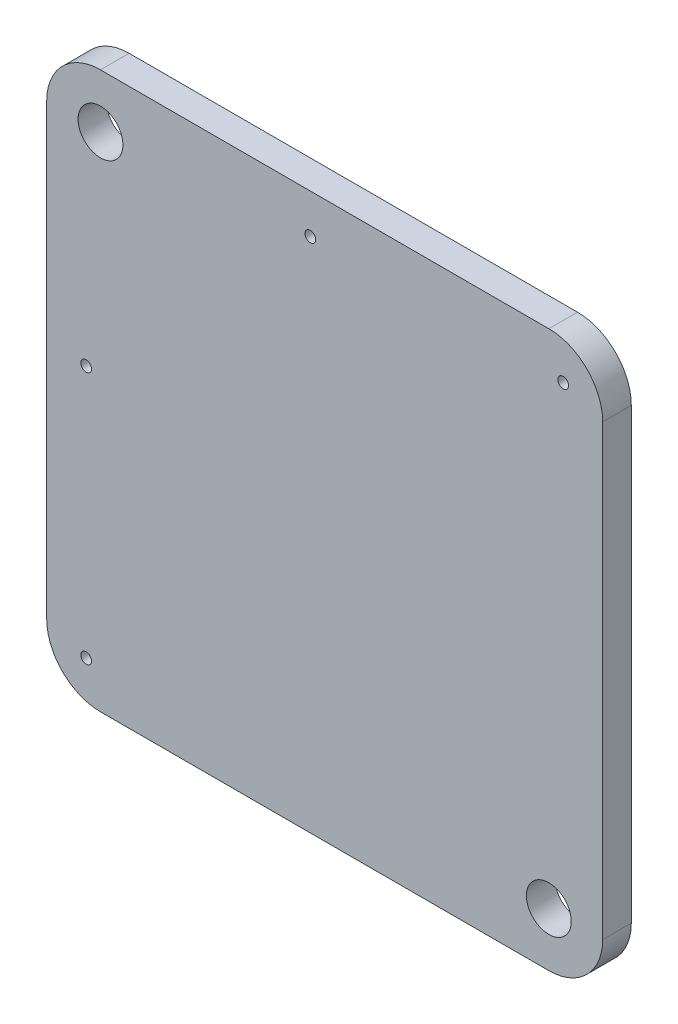
ISO-10303-21;
HEADER;
FILE_DESCRIPTION(('STEP AP214'),'2;1');
FILE_NAME('part.step','',(''),(''),'','','');
FILE_SCHEMA(('AUTOMOTIVE_DESIGN { 1 0 10303 214 1 1 1 1 }'));
ENDSEC;
DATA;
#1=APPLICATION_CONTEXT('core data for automotive mechanical design processes');
#2=APPLICATION_PROTOCOL_DEFINITION('international standard','automotive_design',2000,#1);
#3=PRODUCT_CONTEXT('',#1,'mechanical');
#4=PRODUCT('Part','Part','',(#3));
#5=PRODUCT_RELATED_PRODUCT_CATEGORY('part','',(#4));
#6=PRODUCT_DEFINITION_FORMATION('','',#4);
#7=PRODUCT_DEFINITION_CONTEXT('part definition',#1,'design');
#8=PRODUCT_DEFINITION('design','',#6,#7);
#9=PRODUCT_DEFINITION_SHAPE('','',#8);
#10=(LENGTH_UNIT() NAMED_UNIT(*) SI_UNIT(.MILLI.,.METRE.));
#11=(NAMED_UNIT(*) PLANE_ANGLE_UNIT() SI_UNIT($,.RADIAN.));
#12=(NAMED_UNIT(*) SI_UNIT($,.STERADIAN.) SOLID_ANGLE_UNIT());
#13=UNCERTAINTY_MEASURE_WITH_UNIT(LENGTH_MEASURE(1.E-05),#10,'distance_accuracy_value','');
#14=(GEOMETRIC_REPRESENTATION_CONTEXT(3) GLOBAL_UNCERTAINTY_ASSIGNED_CONTEXT((#13)) GLOBAL_UNIT_ASSIGNED_CONTEXT((#10,
#11,#12)) REPRESENTATION_CONTEXT('',''));
#15=CARTESIAN_POINT('',(0.,0.,0.));
#16=DIRECTION('',(0.,0.,1.));
#17=DIRECTION('',(1.,0.,0.));
#18=AXIS2_PLACEMENT_3D('',#15,#16,#17);
#19=CARTESIAN_POINT('',(111.941010000017,64.0809899999833,1.598));
#20=DIRECTION('',(0.,0.,-1.));
#21=DIRECTION('',(-1.,0.,0.));
#22=AXIS2_PLACEMENT_3D('',#19,#20,#21);
#23=CYLINDRICAL_SURFACE('',#22,2.99999);
#24=CARTESIAN_POINT('',(111.941010000017,64.0809899999833,0.));
#25=DIRECTION('',(0.,0.,1.));
#26=DIRECTION('',(-1.,0.,0.));
#27=AXIS2_PLACEMENT_3D('',#24,#25,#26);
#28=CIRCLE('',#27,2.99999);
#29=CARTESIAN_POINT('',(111.941,61.081,0.));
#30=VERTEX_POINT('',#29);
#31=CARTESIAN_POINT('',(114.941,64.081,0.));
#32=VERTEX_POINT('',#31);
#33=EDGE_CURVE('E138',#30,#32,#28,.T.);
#34=ORIENTED_EDGE('',*,*,#33,.T.);
#35=DIRECTION('',(0.,0.,-1.));
#36=VECTOR('',#35,1.);
#37=CARTESIAN_POINT('',(114.941,64.081,1.598));
#38=LINE('',#37,#36);
#39=CARTESIAN_POINT('',(114.941,64.081,1.598));
#40=VERTEX_POINT('',#39);
#41=EDGE_CURVE('E11',#40,#32,#38,.T.);
#42=ORIENTED_EDGE('',*,*,#41,.F.);
#43=CARTESIAN_POINT('',(111.941010000017,64.0809899999833,1.598));
#44=DIRECTION('',(0.,0.,1.));
#45=DIRECTION('',(-1.,0.,0.));
#46=AXIS2_PLACEMENT_3D('',#43,#44,#45);
#47=CIRCLE('',#46,2.99999);
#48=CARTESIAN_POINT('',(111.941,61.081,1.598));
#49=VERTEX_POINT('',#48);
#50=EDGE_CURVE('E153',#49,#40,#47,.T.);
#51=ORIENTED_EDGE('',*,*,#50,.F.);
#52=DIRECTION('',(0.,0.,-1.));
#53=VECTOR('',#52,1.);
#54=CARTESIAN_POINT('',(111.941,61.081,1.598));
#55=LINE('',#54,#53);
#56=EDGE_CURVE('E134',#49,#30,#55,.T.);
#57=ORIENTED_EDGE('',*,*,#56,.T.);
#58=EDGE_LOOP('',(#34,#42,#51,#57));
#59=FACE_BOUND('',#58,.T.);
#60=ADVANCED_FACE('F42',(#59),#23,.T.);
#61=CARTESIAN_POINT('',(114.941,89.081,1.598));
#62=DIRECTION('',(-1.,0.,0.));
#63=DIRECTION('',(0.,0.,1.));
#64=AXIS2_PLACEMENT_3D('',#61,#62,#63);
#65=PLANE('',#64);
#66=DIRECTION('',(0.,1.,0.));
#67=VECTOR('',#66,1.);
#68=CARTESIAN_POINT('',(114.941,89.081,0.));
#69=LINE('',#68,#67);
#70=CARTESIAN_POINT('',(114.941,89.081,0.));
#71=VERTEX_POINT('',#70);
#72=EDGE_CURVE('E141',#32,#71,#69,.T.);
#73=ORIENTED_EDGE('',*,*,#72,.T.);
#74=DIRECTION('',(0.,0.,-1.));
#75=VECTOR('',#74,1.);
#76=CARTESIAN_POINT('',(114.941,89.081,1.598));
#77=LINE('',#76,#75);
#78=CARTESIAN_POINT('',(114.941,89.081,1.598));
#79=VERTEX_POINT('',#78);
#80=EDGE_CURVE('E50',#79,#71,#77,.T.);
#81=ORIENTED_EDGE('',*,*,#80,.F.);
#82=DIRECTION('',(0.,1.,0.));
#83=VECTOR('',#82,1.);
#84=CARTESIAN_POINT('',(114.941,89.081,1.598));
#85=LINE('',#84,#83);
#86=EDGE_CURVE('E101',#40,#79,#85,.T.);
#87=ORIENTED_EDGE('',*,*,#86,.F.);
#88=ORIENTED_EDGE('',*,*,#41,.T.);
#89=EDGE_LOOP('',(#73,#81,#87,#88));
#90=FACE_BOUND('',#89,.T.);
#91=ADVANCED_FACE('F251',(#90),#65,.F.);
#92=CARTESIAN_POINT('',(111.941020000067,89.0810200000667,1.598));
#93=DIRECTION('',(0.,0.,-1.));
#94=DIRECTION('',(-1.,0.,0.));
#95=AXIS2_PLACEMENT_3D('',#92,#93,#94);
#96=CYLINDRICAL_SURFACE('',#95,2.99998);
#97=CARTESIAN_POINT('',(111.941020000067,89.0810200000667,0.));
#98=DIRECTION('',(0.,0.,1.));
#99=DIRECTION('',(-1.,0.,0.));
#100=AXIS2_PLACEMENT_3D('',#97,#98,#99);
#101=CIRCLE('',#100,2.99998);
#102=CARTESIAN_POINT('',(111.941,92.081,0.));
#103=VERTEX_POINT('',#102);
#104=EDGE_CURVE('E144',#71,#103,#101,.T.);
#105=ORIENTED_EDGE('',*,*,#104,.T.);
#106=DIRECTION('',(0.,0.,-1.));
#107=VECTOR('',#106,1.);
#108=CARTESIAN_POINT('',(111.941,92.081,1.598));
#109=LINE('',#108,#107);
#110=CARTESIAN_POINT('',(111.941,92.081,1.598));
#111=VERTEX_POINT('',#110);
#112=EDGE_CURVE('E160',#111,#103,#109,.T.);
#113=ORIENTED_EDGE('',*,*,#112,.F.);
#114=CARTESIAN_POINT('',(111.941020000067,89.0810200000667,1.598));
#115=DIRECTION('',(0.,0.,1.));
#116=DIRECTION('',(-1.,0.,0.));
#117=AXIS2_PLACEMENT_3D('',#114,#115,#116);
#118=CIRCLE('',#117,2.99998);
#119=EDGE_CURVE('E168',#79,#111,#118,.T.);
#120=ORIENTED_EDGE('',*,*,#119,.F.);
#121=ORIENTED_EDGE('',*,*,#80,.T.);
#122=EDGE_LOOP('',(#105,#113,#120,#121));
#123=FACE_BOUND('',#122,.T.);
#124=ADVANCED_FACE('F166',(#123),#96,.T.);
#125=CARTESIAN_POINT('',(86.941,92.081,1.598));
#126=DIRECTION('',(0.,-1.,0.));
#127=DIRECTION('',(0.,0.,-1.));
#128=AXIS2_PLACEMENT_3D('',#125,#126,#127);
#129=PLANE('',#128);
#130=DIRECTION('',(-1.,0.,0.));
#131=VECTOR('',#130,1.);
#132=CARTESIAN_POINT('',(86.941,92.081,0.));
#133=LINE('',#132,#131);
#134=CARTESIAN_POINT('',(86.941,92.081,0.));
#135=VERTEX_POINT('',#134);
#136=EDGE_CURVE('E146',#103,#135,#133,.T.);
#137=ORIENTED_EDGE('',*,*,#136,.T.);
#138=DIRECTION('',(0.,0.,-1.));
#139=VECTOR('',#138,1.);
#140=CARTESIAN_POINT('',(86.941,92.081,1.598));
#141=LINE('',#140,#139);
#142=CARTESIAN_POINT('',(86.941,92.081,1.598));
#143=VERTEX_POINT('',#142);
#144=EDGE_CURVE('E157',#143,#135,#141,.T.);
#145=ORIENTED_EDGE('',*,*,#144,.F.);
#146=DIRECTION('',(-1.,0.,0.));
#147=VECTOR('',#146,1.);
#148=CARTESIAN_POINT('',(86.941,92.081,1.598));
#149=LINE('',#148,#147);
#150=EDGE_CURVE('E180',#111,#143,#149,.T.);
#151=ORIENTED_EDGE('',*,*,#150,.F.);
#152=ORIENTED_EDGE('',*,*,#112,.T.);
#153=EDGE_LOOP('',(#137,#145,#151,#152));
#154=FACE_BOUND('',#153,.T.);
#155=ADVANCED_FACE('F176',(#154),#129,.F.);
#156=CARTESIAN_POINT('',(86.9409899999833,89.0810100000167,1.598));
#157=DIRECTION('',(0.,0.,-1.));
#158=DIRECTION('',(-1.,0.,0.));
#159=AXIS2_PLACEMENT_3D('',#156,#157,#158);
#160=CYLINDRICAL_SURFACE('',#159,2.99998999999999);
#161=CARTESIAN_POINT('',(86.9409899999833,89.0810100000167,0.));
#162=DIRECTION('',(0.,0.,1.));
#163=DIRECTION('',(-1.,0.,0.));
#164=AXIS2_PLACEMENT_3D('',#161,#162,#163);
#165=CIRCLE('',#164,2.99998999999999);
#166=CARTESIAN_POINT('',(83.941,89.081,0.));
#167=VERTEX_POINT('',#166);
#168=EDGE_CURVE('E148',#135,#167,#165,.T.);
#169=ORIENTED_EDGE('',*,*,#168,.T.);
#170=DIRECTION('',(0.,0.,-1.));
#171=VECTOR('',#170,1.);
#172=CARTESIAN_POINT('',(83.941,89.081,1.598));
#173=LINE('',#172,#171);
#174=CARTESIAN_POINT('',(83.941,89.081,1.598));
#175=VERTEX_POINT('',#174);
#176=EDGE_CURVE('E129',#175,#167,#173,.T.);
#177=ORIENTED_EDGE('',*,*,#176,.F.);
#178=CARTESIAN_POINT('',(86.9409899999833,89.0810100000167,1.598));
#179=DIRECTION('',(0.,0.,1.));
#180=DIRECTION('',(-1.,0.,0.));
#181=AXIS2_PLACEMENT_3D('',#178,#179,#180);
#182=CIRCLE('',#181,2.99998999999999);
#183=EDGE_CURVE('E120',#143,#175,#182,.T.);
#184=ORIENTED_EDGE('',*,*,#183,.F.);
#185=ORIENTED_EDGE('',*,*,#144,.T.);
#186=EDGE_LOOP('',(#169,#177,#184,#185));
#187=FACE_BOUND('',#186,.T.);
#188=ADVANCED_FACE('F179',(#187),#160,.T.);
#189=CARTESIAN_POINT('',(83.941,64.081,1.598));
#190=DIRECTION('',(1.,0.,0.));
#191=DIRECTION('',(0.,0.,-1.));
#192=AXIS2_PLACEMENT_3D('',#189,#190,#191);
#193=PLANE('',#192);
#194=DIRECTION('',(0.,-1.,0.));
#195=VECTOR('',#194,1.);
#196=CARTESIAN_POINT('',(83.941,64.081,0.));
#197=LINE('',#196,#195);
#198=CARTESIAN_POINT('',(83.941,64.081,0.));
#199=VERTEX_POINT('',#198);
#200=EDGE_CURVE('E128',#167,#199,#197,.T.);
#201=ORIENTED_EDGE('',*,*,#200,.T.);
#202=DIRECTION('',(0.,0.,-1.));
#203=VECTOR('',#202,1.);
#204=CARTESIAN_POINT('',(83.941,64.081,1.598));
#205=LINE('',#204,#203);
#206=CARTESIAN_POINT('',(83.941,64.081,1.598));
#207=VERTEX_POINT('',#206);
#208=EDGE_CURVE('E125',#207,#199,#205,.T.);
#209=ORIENTED_EDGE('',*,*,#208,.F.);
#210=DIRECTION('',(0.,-1.,0.));
#211=VECTOR('',#210,1.);
#212=CARTESIAN_POINT('',(83.941,64.081,1.598));
#213=LINE('',#212,#211);
#214=EDGE_CURVE('E114',#175,#207,#213,.T.);
#215=ORIENTED_EDGE('',*,*,#214,.F.);
#216=ORIENTED_EDGE('',*,*,#176,.T.);
#217=EDGE_LOOP('',(#201,#209,#215,#216));
#218=FACE_BOUND('',#217,.T.);
#219=ADVANCED_FACE('F126',(#218),#193,.F.);
#220=CARTESIAN_POINT('',(86.9409799999333,64.0809799999333,1.598));
#221=DIRECTION('',(0.,0.,-1.));
#222=DIRECTION('',(-1.,0.,0.));
#223=AXIS2_PLACEMENT_3D('',#220,#221,#222);
#224=CYLINDRICAL_SURFACE('',#223,2.99997999999999);
#225=CARTESIAN_POINT('',(86.9409799999333,64.0809799999333,0.));
#226=DIRECTION('',(0.,0.,1.));
#227=DIRECTION('',(-1.,0.,0.));
#228=AXIS2_PLACEMENT_3D('',#225,#226,#227);
#229=CIRCLE('',#228,2.99997999999999);
#230=CARTESIAN_POINT('',(86.941,61.081,0.));
#231=VERTEX_POINT('',#230);
#232=EDGE_CURVE('E87',#199,#231,#229,.T.);
#233=ORIENTED_EDGE('',*,*,#232,.T.);
#234=DIRECTION('',(0.,0.,-1.));
#235=VECTOR('',#234,1.);
#236=CARTESIAN_POINT('',(86.941,61.081,1.598));
#237=LINE('',#236,#235);
#238=CARTESIAN_POINT('',(86.941,61.081,1.598));
#239=VERTEX_POINT('',#238);
#240=EDGE_CURVE('E130',#239,#231,#237,.T.);
#241=ORIENTED_EDGE('',*,*,#240,.F.);
#242=CARTESIAN_POINT('',(86.9409799999333,64.0809799999333,1.598));
#243=DIRECTION('',(0.,0.,1.));
#244=DIRECTION('',(-1.,0.,0.));
#245=AXIS2_PLACEMENT_3D('',#242,#243,#244);
#246=CIRCLE('',#245,2.99997999999999);
#247=EDGE_CURVE('E118',#207,#239,#246,.T.);
#248=ORIENTED_EDGE('',*,*,#247,.F.);
#249=ORIENTED_EDGE('',*,*,#208,.T.);
#250=EDGE_LOOP('',(#233,#241,#248,#249));
#251=FACE_BOUND('',#250,.T.);
#252=ADVANCED_FACE('F132',(#251),#224,.T.);
#253=CARTESIAN_POINT('',(111.941,61.081,1.598));
#254=DIRECTION('',(0.,1.,0.));
#255=DIRECTION('',(0.,0.,1.));
#256=AXIS2_PLACEMENT_3D('',#253,#254,#255);
#257=PLANE('',#256);
#258=DIRECTION('',(1.,0.,0.));
#259=VECTOR('',#258,1.);
#260=CARTESIAN_POINT('',(111.941,61.081,0.));
#261=LINE('',#260,#259);
#262=EDGE_CURVE('E93',#231,#30,#261,.T.);
#263=ORIENTED_EDGE('',*,*,#262,.T.);
#264=ORIENTED_EDGE('',*,*,#56,.F.);
#265=DIRECTION('',(1.,0.,0.));
#266=VECTOR('',#265,1.);
#267=CARTESIAN_POINT('',(111.941,61.081,1.598));
#268=LINE('',#267,#266);
#269=EDGE_CURVE('E58',#239,#49,#268,.T.);
#270=ORIENTED_EDGE('',*,*,#269,.F.);
#271=ORIENTED_EDGE('',*,*,#240,.T.);
#272=EDGE_LOOP('',(#263,#264,#270,#271));
#273=FACE_BOUND('',#272,.T.);
#274=ADVANCED_FACE('F258',(#273),#257,.F.);
#275=CARTESIAN_POINT('',(111.941010000017,64.0809899999833,1.598));
#276=DIRECTION('',(0.,0.,-1.));
#277=DIRECTION('',(-1.,0.,0.));
#278=AXIS2_PLACEMENT_3D('',#275,#276,#277);
#279=PLANE('',#278);
#280=CARTESIAN_POINT('',(86.941,89.081,1.598));
#281=DIRECTION('',(0.,0.,-1.));
#282=DIRECTION('',(-1.,0.,0.));
#283=AXIS2_PLACEMENT_3D('',#280,#281,#282);
#284=CIRCLE('',#283,1.24999999999999);
#285=CARTESIAN_POINT('',(85.691,89.081,1.598));
#286=VERTEX_POINT('',#285);
#287=EDGE_CURVE('E215',#286,#286,#284,.T.);
#288=ORIENTED_EDGE('',*,*,#287,.T.);
#289=EDGE_LOOP('',(#288));
#290=FACE_BOUND('',#289,.T.);
#291=CARTESIAN_POINT('',(111.941,64.081,1.598));
#292=DIRECTION('',(0.,0.,-1.));
#293=DIRECTION('',(-1.,0.,0.));
#294=AXIS2_PLACEMENT_3D('',#291,#292,#293);
#295=CIRCLE('',#294,1.24999999999999);
#296=CARTESIAN_POINT('',(110.691,64.081,1.598));
#297=VERTEX_POINT('',#296);
#298=EDGE_CURVE('E209',#297,#297,#295,.T.);
#299=ORIENTED_EDGE('',*,*,#298,.T.);
#300=EDGE_LOOP('',(#299));
#301=FACE_BOUND('',#300,.T.);
#302=CARTESIAN_POINT('',(98.641,89.881,1.598));
#303=DIRECTION('',(0.,0.,-1.));
#304=DIRECTION('',(-1.,0.,0.));
#305=AXIS2_PLACEMENT_3D('',#302,#303,#304);
#306=CIRCLE('',#305,0.299999999999981);
#307=CARTESIAN_POINT('',(98.341,89.881,1.598));
#308=VERTEX_POINT('',#307);
#309=EDGE_CURVE('E203',#308,#308,#306,.T.);
#310=ORIENTED_EDGE('',*,*,#309,.T.);
#311=EDGE_LOOP('',(#310));
#312=FACE_BOUND('',#311,.T.);
#313=CARTESIAN_POINT('',(112.741,89.881,1.598));
#314=DIRECTION('',(0.,0.,-1.));
#315=DIRECTION('',(-1.,0.,0.));
#316=AXIS2_PLACEMENT_3D('',#313,#314,#315);
#317=CIRCLE('',#316,0.299999999999981);
#318=CARTESIAN_POINT('',(112.441,89.881,1.598));
#319=VERTEX_POINT('',#318);
#320=EDGE_CURVE('E197',#319,#319,#317,.T.);
#321=ORIENTED_EDGE('',*,*,#320,.T.);
#322=EDGE_LOOP('',(#321));
#323=FACE_BOUND('',#322,.T.);
#324=CARTESIAN_POINT('',(86.141,63.281,1.598));
#325=DIRECTION('',(0.,0.,-1.));
#326=DIRECTION('',(-1.,0.,0.));
#327=AXIS2_PLACEMENT_3D('',#324,#325,#326);
#328=CIRCLE('',#327,0.299999999999981);
#329=CARTESIAN_POINT('',(85.841,63.281,1.598));
#330=VERTEX_POINT('',#329);
#331=EDGE_CURVE('E191',#330,#330,#328,.T.);
#332=ORIENTED_EDGE('',*,*,#331,.T.);
#333=EDGE_LOOP('',(#332));
#334=FACE_BOUND('',#333,.T.);
#335=CARTESIAN_POINT('',(86.141,77.381,1.598));
#336=DIRECTION('',(0.,0.,-1.));
#337=DIRECTION('',(-1.,0.,0.));
#338=AXIS2_PLACEMENT_3D('',#335,#336,#337);
#339=CIRCLE('',#338,0.299999999999981);
#340=CARTESIAN_POINT('',(85.841,77.381,1.598));
#341=VERTEX_POINT('',#340);
#342=EDGE_CURVE('E142',#341,#341,#339,.T.);
#343=ORIENTED_EDGE('',*,*,#342,.T.);
#344=EDGE_LOOP('',(#343));
#345=FACE_BOUND('',#344,.T.);
#346=ORIENTED_EDGE('',*,*,#50,.T.);
#347=ORIENTED_EDGE('',*,*,#86,.T.);
#348=ORIENTED_EDGE('',*,*,#119,.T.);
#349=ORIENTED_EDGE('',*,*,#150,.T.);
#350=ORIENTED_EDGE('',*,*,#183,.T.);
#351=ORIENTED_EDGE('',*,*,#214,.T.);
#352=ORIENTED_EDGE('',*,*,#247,.T.);
#353=ORIENTED_EDGE('',*,*,#269,.T.);
#354=EDGE_LOOP('',(#346,#347,#348,#349,#350,#351,#352,#353));
#355=FACE_BOUND('',#354,.T.);
#356=ADVANCED_FACE('F116',(#290,#301,#312,#323,#334,#345,#355),#279,.F.);
#357=CARTESIAN_POINT('',(111.941010000017,64.0809899999833,0.));
#358=DIRECTION('',(0.,0.,-1.));
#359=DIRECTION('',(-1.,0.,0.));
#360=AXIS2_PLACEMENT_3D('',#357,#358,#359);
#361=PLANE('',#360);
#362=CARTESIAN_POINT('',(86.941,89.081,0.));
#363=DIRECTION('',(0.,0.,-1.));
#364=DIRECTION('',(-1.,0.,0.));
#365=AXIS2_PLACEMENT_3D('',#362,#363,#364);
#366=CIRCLE('',#365,1.24999999999999);
#367=CARTESIAN_POINT('',(85.691,89.081,0.));
#368=VERTEX_POINT('',#367);
#369=EDGE_CURVE('E218',#368,#368,#366,.T.);
#370=ORIENTED_EDGE('',*,*,#369,.F.);
#371=EDGE_LOOP('',(#370));
#372=FACE_BOUND('',#371,.T.);
#373=CARTESIAN_POINT('',(111.941,64.081,0.));
#374=DIRECTION('',(0.,0.,-1.));
#375=DIRECTION('',(-1.,0.,0.));
#376=AXIS2_PLACEMENT_3D('',#373,#374,#375);
#377=CIRCLE('',#376,1.24999999999999);
#378=CARTESIAN_POINT('',(110.691,64.081,0.));
#379=VERTEX_POINT('',#378);
#380=EDGE_CURVE('E212',#379,#379,#377,.T.);
#381=ORIENTED_EDGE('',*,*,#380,.F.);
#382=EDGE_LOOP('',(#381));
#383=FACE_BOUND('',#382,.T.);
#384=CARTESIAN_POINT('',(98.641,89.881,0.));
#385=DIRECTION('',(0.,0.,-1.));
#386=DIRECTION('',(-1.,0.,0.));
#387=AXIS2_PLACEMENT_3D('',#384,#385,#386);
#388=CIRCLE('',#387,0.299999999999995);
#389=CARTESIAN_POINT('',(98.341,89.881,0.));
#390=VERTEX_POINT('',#389);
#391=EDGE_CURVE('E206',#390,#390,#388,.T.);
#392=ORIENTED_EDGE('',*,*,#391,.F.);
#393=EDGE_LOOP('',(#392));
#394=FACE_BOUND('',#393,.T.);
#395=CARTESIAN_POINT('',(112.741,89.881,0.));
#396=DIRECTION('',(0.,0.,-1.));
#397=DIRECTION('',(-1.,0.,0.));
#398=AXIS2_PLACEMENT_3D('',#395,#396,#397);
#399=CIRCLE('',#398,0.299999999999995);
#400=CARTESIAN_POINT('',(112.441,89.881,0.));
#401=VERTEX_POINT('',#400);
#402=EDGE_CURVE('E200',#401,#401,#399,.T.);
#403=ORIENTED_EDGE('',*,*,#402,.F.);
#404=EDGE_LOOP('',(#403));
#405=FACE_BOUND('',#404,.T.);
#406=CARTESIAN_POINT('',(86.141,63.281,0.));
#407=DIRECTION('',(0.,0.,-1.));
#408=DIRECTION('',(-1.,0.,0.));
#409=AXIS2_PLACEMENT_3D('',#406,#407,#408);
#410=CIRCLE('',#409,0.299999999999981);
#411=CARTESIAN_POINT('',(85.841,63.281,0.));
#412=VERTEX_POINT('',#411);
#413=EDGE_CURVE('E194',#412,#412,#410,.T.);
#414=ORIENTED_EDGE('',*,*,#413,.F.);
#415=EDGE_LOOP('',(#414));
#416=FACE_BOUND('',#415,.T.);
#417=CARTESIAN_POINT('',(86.141,77.381,0.));
#418=DIRECTION('',(0.,0.,-1.));
#419=DIRECTION('',(-1.,0.,0.));
#420=AXIS2_PLACEMENT_3D('',#417,#418,#419);
#421=CIRCLE('',#420,0.299999999999981);
#422=CARTESIAN_POINT('',(85.841,77.381,0.));
#423=VERTEX_POINT('',#422);
#424=EDGE_CURVE('E188',#423,#423,#421,.T.);
#425=ORIENTED_EDGE('',*,*,#424,.F.);
#426=EDGE_LOOP('',(#425));
#427=FACE_BOUND('',#426,.T.);
#428=ORIENTED_EDGE('',*,*,#33,.F.);
#429=ORIENTED_EDGE('',*,*,#262,.F.);
#430=ORIENTED_EDGE('',*,*,#232,.F.);
#431=ORIENTED_EDGE('',*,*,#200,.F.);
#432=ORIENTED_EDGE('',*,*,#168,.F.);
#433=ORIENTED_EDGE('',*,*,#136,.F.);
#434=ORIENTED_EDGE('',*,*,#104,.F.);
#435=ORIENTED_EDGE('',*,*,#72,.F.);
#436=EDGE_LOOP('',(#428,#429,#430,#431,#432,#433,#434,#435));
#437=FACE_BOUND('',#436,.T.);
#438=ADVANCED_FACE('F172',(#372,#383,#394,#405,#416,#427,#437),#361,.T.);
#439=CARTESIAN_POINT('',(86.141,77.381,0.));
#440=DIRECTION('',(0.,0.,-1.));
#441=DIRECTION('',(-1.,0.,0.));
#442=AXIS2_PLACEMENT_3D('',#439,#440,#441);
#443=CYLINDRICAL_SURFACE('',#442,0.299999999999981);
#444=ORIENTED_EDGE('',*,*,#342,.F.);
#445=EDGE_LOOP('',(#444));
#446=FACE_BOUND('',#445,.T.);
#447=ORIENTED_EDGE('',*,*,#424,.T.);
#448=EDGE_LOOP('',(#447));
#449=FACE_BOUND('',#448,.T.);
#450=ADVANCED_FACE('F226',(#446,#449),#443,.F.);
#451=CARTESIAN_POINT('',(86.141,63.281,0.));
#452=DIRECTION('',(0.,0.,-1.));
#453=DIRECTION('',(-1.,0.,0.));
#454=AXIS2_PLACEMENT_3D('',#451,#452,#453);
#455=CYLINDRICAL_SURFACE('',#454,0.299999999999981);
#456=ORIENTED_EDGE('',*,*,#331,.F.);
#457=EDGE_LOOP('',(#456));
#458=FACE_BOUND('',#457,.T.);
#459=ORIENTED_EDGE('',*,*,#413,.T.);
#460=EDGE_LOOP('',(#459));
#461=FACE_BOUND('',#460,.T.);
#462=ADVANCED_FACE('F239',(#458,#461),#455,.F.);
#463=CARTESIAN_POINT('',(112.741,89.881,0.));
#464=DIRECTION('',(0.,0.,-1.));
#465=DIRECTION('',(-1.,0.,0.));
#466=AXIS2_PLACEMENT_3D('',#463,#464,#465);
#467=CYLINDRICAL_SURFACE('',#466,0.299999999999988);
#468=ORIENTED_EDGE('',*,*,#320,.F.);
#469=EDGE_LOOP('',(#468));
#470=FACE_BOUND('',#469,.T.);
#471=ORIENTED_EDGE('',*,*,#402,.T.);
#472=EDGE_LOOP('',(#471));
#473=FACE_BOUND('',#472,.T.);
#474=ADVANCED_FACE('F245',(#470,#473),#467,.F.);
#475=CARTESIAN_POINT('',(98.641,89.881,0.));
#476=DIRECTION('',(0.,0.,-1.));
#477=DIRECTION('',(-1.,0.,0.));
#478=AXIS2_PLACEMENT_3D('',#475,#476,#477);
#479=CYLINDRICAL_SURFACE('',#478,0.299999999999988);
#480=ORIENTED_EDGE('',*,*,#309,.F.);
#481=EDGE_LOOP('',(#480));
#482=FACE_BOUND('',#481,.T.);
#483=ORIENTED_EDGE('',*,*,#391,.T.);
#484=EDGE_LOOP('',(#483));
#485=FACE_BOUND('',#484,.T.);
#486=ADVANCED_FACE('F320',(#482,#485),#479,.F.);
#487=CARTESIAN_POINT('',(111.941,64.081,0.));
#488=DIRECTION('',(0.,0.,-1.));
#489=DIRECTION('',(-1.,0.,0.));
#490=AXIS2_PLACEMENT_3D('',#487,#488,#489);
#491=CYLINDRICAL_SURFACE('',#490,1.24999999999999);
#492=ORIENTED_EDGE('',*,*,#298,.F.);
#493=EDGE_LOOP('',(#492));
#494=FACE_BOUND('',#493,.T.);
#495=ORIENTED_EDGE('',*,*,#380,.T.);
#496=EDGE_LOOP('',(#495));
#497=FACE_BOUND('',#496,.T.);
#498=ADVANCED_FACE('F330',(#494,#497),#491,.F.);
#499=CARTESIAN_POINT('',(86.941,89.081,0.));
#500=DIRECTION('',(0.,0.,-1.));
#501=DIRECTION('',(-1.,0.,0.));
#502=AXIS2_PLACEMENT_3D('',#499,#500,#501);
#503=CYLINDRICAL_SURFACE('',#502,1.24999999999999);
#504=ORIENTED_EDGE('',*,*,#287,.F.);
#505=EDGE_LOOP('',(#504));
#506=FACE_BOUND('',#505,.T.);
#507=ORIENTED_EDGE('',*,*,#369,.T.);
#508=EDGE_LOOP('',(#507));
#509=FACE_BOUND('',#508,.T.);
#510=ADVANCED_FACE('F222',(#506,#509),#503,.F.);
#511=CLOSED_SHELL('',(#60,#91,#124,#155,#188,#219,#252,#274,#356,#438,#450,#462,#474,#486,#498,#510));
#512=MANIFOLD_SOLID_BREP('B2',#511);
#513=ADVANCED_BREP_SHAPE_REPRESENTATION('',(#18,#512),#14);
#514=SHAPE_DEFINITION_REPRESENTATION(#9,#513);
ENDSEC;
END-ISO-10303-21;
